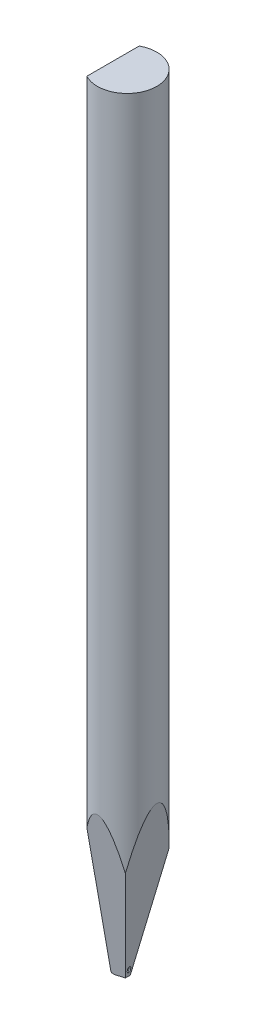
ISO-10303-21;
HEADER;
FILE_DESCRIPTION(('STEP AP214'),'2;1');
FILE_NAME('part.step','',(''),(''),'','','');
FILE_SCHEMA(('AUTOMOTIVE_DESIGN { 1 0 10303 214 1 1 1 1 }'));
ENDSEC;
DATA;
#1=APPLICATION_CONTEXT('core data for automotive mechanical design processes');
#2=APPLICATION_PROTOCOL_DEFINITION('international standard','automotive_design',2000,#1);
#3=PRODUCT_CONTEXT('',#1,'mechanical');
#4=PRODUCT('Part','Part','',(#3));
#5=PRODUCT_RELATED_PRODUCT_CATEGORY('part','',(#4));
#6=PRODUCT_DEFINITION_FORMATION('','',#4);
#7=PRODUCT_DEFINITION_CONTEXT('part definition',#1,'design');
#8=PRODUCT_DEFINITION('design','',#6,#7);
#9=PRODUCT_DEFINITION_SHAPE('','',#8);
#10=(LENGTH_UNIT() NAMED_UNIT(*) SI_UNIT(.MILLI.,.METRE.));
#11=(NAMED_UNIT(*) PLANE_ANGLE_UNIT() SI_UNIT($,.RADIAN.));
#12=(NAMED_UNIT(*) SI_UNIT($,.STERADIAN.) SOLID_ANGLE_UNIT());
#13=UNCERTAINTY_MEASURE_WITH_UNIT(LENGTH_MEASURE(1.E-05),#10,'distance_accuracy_value','');
#14=(GEOMETRIC_REPRESENTATION_CONTEXT(3) GLOBAL_UNCERTAINTY_ASSIGNED_CONTEXT((#13)) GLOBAL_UNIT_ASSIGNED_CONTEXT((#10,
#11,#12)) REPRESENTATION_CONTEXT('',''));
#15=CARTESIAN_POINT('',(0.,0.,0.));
#16=DIRECTION('',(0.,0.,1.));
#17=DIRECTION('',(1.,0.,0.));
#18=AXIS2_PLACEMENT_3D('',#15,#16,#17);
#19=CARTESIAN_POINT('',(26.8738719491216,0.,0.0508));
#20=DIRECTION('',(0.,-0.173648177666931,0.984807753012208));
#21=DIRECTION('',(0.,-0.984807753012208,-0.173648177666931));
#22=AXIS2_PLACEMENT_3D('',#19,#20,#21);
#23=PLANE('',#22);
#24=CARTESIAN_POINT('',(-0.34798,0.02794,0.0557265758409919));
#25=DIRECTION('',(0.,-0.173648177666931,0.984807753012208));
#26=DIRECTION('',(0.,-0.984807753012208,-0.173648177666931));
#27=AXIS2_PLACEMENT_3D('',#24,#25,#26);
#28=ELLIPSE('',#27,0.0283710195360877,0.02794);
#29=CARTESIAN_POINT('',(-0.347980000000001,0.,0.0508));
#30=VERTEX_POINT('',#29);
#31=CARTESIAN_POINT('',(-0.37592,0.02794,0.0557265758409919));
#32=VERTEX_POINT('',#31);
#33=EDGE_CURVE('E175',#30,#32,#28,.F.);
#34=ORIENTED_EDGE('',*,*,#33,.F.);
#35=DIRECTION('',(-1.,0.,0.));
#36=VECTOR('',#35,1.);
#37=CARTESIAN_POINT('',(26.8738719491216,0.,0.0508));
#38=LINE('',#37,#36);
#39=CARTESIAN_POINT('',(-0.279399999999999,0.,0.0508000000000002));
#40=VERTEX_POINT('',#39);
#41=EDGE_CURVE('E226',#40,#30,#38,.T.);
#42=ORIENTED_EDGE('',*,*,#41,.F.);
#43=DIRECTION('',(-0.964921520309631,-0.258549942126377,-0.0455893306574928));
#44=VECTOR('',#43,1.);
#45=CARTESIAN_POINT('',(25.0022930459355,6.77420923494997,1.24527586108614));
#46=LINE('',#45,#44);
#47=CARTESIAN_POINT('',(0.0191872540822884,0.0800062136015736,0.0649072540822819));
#48=VERTEX_POINT('',#47);
#49=EDGE_CURVE('E233',#48,#40,#46,.T.);
#50=ORIENTED_EDGE('',*,*,#49,.F.);
#51=DIRECTION('',(-0.171087869746036,-0.970287525247814,-0.171087869746036));
#52=VECTOR('',#51,1.);
#53=CARTESIAN_POINT('',(0.791557999082995,4.46033837772866,0.837277999082991));
#54=LINE('',#53,#52);
#55=CARTESIAN_POINT('',(0.537041505266776,3.01690361355589,0.582761505266771));
#56=VERTEX_POINT('',#55);
#57=EDGE_CURVE('E237',#56,#48,#54,.T.);
#58=ORIENTED_EDGE('',*,*,#57,.F.);
#59=CARTESIAN_POINT('',(0.,-0.288101116436578,0.));
#60=DIRECTION('',(0.,-0.173648177666931,0.984807753012208));
#61=DIRECTION('',(0.,-0.984807753012208,-0.173648177666931));
#62=AXIS2_PLACEMENT_3D('',#59,#60,#61);
#63=ELLIPSE('',#62,4.56371043248163,0.792479999999998);
#64=CARTESIAN_POINT('',(-0.37592,3.66844093071415,0.69764511322018));
#65=VERTEX_POINT('',#64);
#66=EDGE_CURVE('E235',#56,#65,#63,.T.);
#67=ORIENTED_EDGE('',*,*,#66,.T.);
#68=DIRECTION('',(0.,0.984807753012208,0.173648177666931));
#69=VECTOR('',#68,1.);
#70=CARTESIAN_POINT('',(-0.37592,20.251112252608,3.62161747949059));
#71=LINE('',#70,#69);
#72=EDGE_CURVE('E54',#32,#65,#71,.T.);
#73=ORIENTED_EDGE('',*,*,#72,.F.);
#74=EDGE_LOOP('',(#34,#42,#50,#58,#67,#73));
#75=FACE_BOUND('',#74,.T.);
#76=ADVANCED_FACE('F46',(#75),#23,.T.);
#77=CARTESIAN_POINT('',(26.8738719491216,0.,-0.0508));
#78=DIRECTION('',(0.,-0.173648177666931,-0.984807753012208));
#79=DIRECTION('',(0.,0.984807753012208,-0.173648177666931));
#80=AXIS2_PLACEMENT_3D('',#77,#78,#79);
#81=PLANE('',#80);
#82=CARTESIAN_POINT('',(-0.34798,0.02794,-0.0557265758409954));
#83=DIRECTION('',(0.,-0.173648177666931,-0.984807753012208));
#84=DIRECTION('',(0.,0.984807753012208,-0.173648177666931));
#85=AXIS2_PLACEMENT_3D('',#82,#83,#84);
#86=ELLIPSE('',#85,0.0283710195360877,0.02794);
#87=CARTESIAN_POINT('',(-0.37592,0.02794,-0.0557265758409954));
#88=VERTEX_POINT('',#87);
#89=CARTESIAN_POINT('',(-0.347980000085551,0.,-0.0508));
#90=VERTEX_POINT('',#89);
#91=EDGE_CURVE('E76',#88,#90,#86,.F.);
#92=ORIENTED_EDGE('',*,*,#91,.F.);
#93=DIRECTION('',(0.,-0.984807753012208,0.173648177666931));
#94=VECTOR('',#93,1.);
#95=CARTESIAN_POINT('',(-0.37592,20.5255765703836,-3.67001294395617));
#96=LINE('',#95,#94);
#97=CARTESIAN_POINT('',(-0.37592,3.66844093071414,-0.69764511322018));
#98=VERTEX_POINT('',#97);
#99=EDGE_CURVE('E167',#98,#88,#96,.T.);
#100=ORIENTED_EDGE('',*,*,#99,.F.);
#101=CARTESIAN_POINT('',(0.,-0.288101116436578,0.));
#102=DIRECTION('',(0.,-0.173648177666931,-0.984807753012208));
#103=DIRECTION('',(0.,-0.984807753012208,0.173648177666931));
#104=AXIS2_PLACEMENT_3D('',#101,#102,#103);
#105=ELLIPSE('',#104,4.56371043248163,0.792479999999998);
#106=CARTESIAN_POINT('',(0.537041505266776,3.01690361355589,-0.582761505266771));
#107=VERTEX_POINT('',#106);
#108=EDGE_CURVE('E387',#98,#107,#105,.T.);
#109=ORIENTED_EDGE('',*,*,#108,.T.);
#110=DIRECTION('',(0.171087869746036,0.970287525247814,-0.171087869746036));
#111=VECTOR('',#110,1.);
#112=CARTESIAN_POINT('',(0.791557999082995,4.46033837772866,-0.837277999082991));
#113=LINE('',#112,#111);
#114=CARTESIAN_POINT('',(0.0191872540822884,0.0800062136015736,-0.0649072540822819));
#115=VERTEX_POINT('',#114);
#116=EDGE_CURVE('E250',#115,#107,#113,.T.);
#117=ORIENTED_EDGE('',*,*,#116,.F.);
#118=DIRECTION('',(0.964921520309631,0.258549942126377,-0.0455893306574928));
#119=VECTOR('',#118,1.);
#120=CARTESIAN_POINT('',(25.0022930459355,6.77420923494997,-1.24527586108614));
#121=LINE('',#120,#119);
#122=CARTESIAN_POINT('',(-0.279399999999999,0.,-0.0508000000000001));
#123=VERTEX_POINT('',#122);
#124=EDGE_CURVE('E358',#123,#115,#121,.T.);
#125=ORIENTED_EDGE('',*,*,#124,.F.);
#126=DIRECTION('',(-1.,0.,0.));
#127=VECTOR('',#126,1.);
#128=CARTESIAN_POINT('',(26.8738719491216,0.,-0.0508));
#129=LINE('',#128,#127);
#130=EDGE_CURVE('E232',#123,#90,#129,.T.);
#131=ORIENTED_EDGE('',*,*,#130,.T.);
#132=EDGE_LOOP('',(#92,#100,#109,#117,#125,#131));
#133=FACE_BOUND('',#132,.T.);
#134=ADVANCED_FACE('F270',(#133),#81,.T.);
#135=CARTESIAN_POINT('',(0.,21.0312,0.));
#136=DIRECTION('',(0.,-1.,0.));
#137=DIRECTION('',(0.,0.,-1.));
#138=AXIS2_PLACEMENT_3D('',#135,#136,#137);
#139=CYLINDRICAL_SURFACE('',#138,0.792479999999998);
#140=ORIENTED_EDGE('',*,*,#66,.F.);
#141=CARTESIAN_POINT('',(0.,-0.0288101116436568,0.));
#142=DIRECTION('',(-0.984807753012208,0.173648177666931,0.));
#143=DIRECTION('',(-0.173648177666931,-0.984807753012208,0.));
#144=AXIS2_PLACEMENT_3D('',#141,#142,#143);
#145=ELLIPSE('',#144,4.56371043248164,0.792479999999998);
#146=EDGE_CURVE('E380',#56,#107,#145,.T.);
#147=ORIENTED_EDGE('',*,*,#146,.T.);
#148=ORIENTED_EDGE('',*,*,#108,.F.);
#149=DIRECTION('',(0.,-1.,0.));
#150=VECTOR('',#149,1.);
#151=CARTESIAN_POINT('',(-0.37592,21.0312,-0.69764511322018));
#152=LINE('',#151,#150);
#153=CARTESIAN_POINT('',(-0.37592,21.0312,-0.69764511322018));
#154=VERTEX_POINT('',#153);
#155=EDGE_CURVE('E393',#154,#98,#152,.T.);
#156=ORIENTED_EDGE('',*,*,#155,.F.);
#157=CARTESIAN_POINT('',(0.,21.0312,0.));
#158=DIRECTION('',(0.,1.,0.));
#159=DIRECTION('',(0.,0.,1.));
#160=AXIS2_PLACEMENT_3D('',#157,#158,#159);
#161=CIRCLE('',#160,0.792479999999998);
#162=CARTESIAN_POINT('',(-0.37592,21.0312,0.69764511322018));
#163=VERTEX_POINT('',#162);
#164=EDGE_CURVE('E395',#163,#154,#161,.T.);
#165=ORIENTED_EDGE('',*,*,#164,.F.);
#166=DIRECTION('',(0.,-1.,0.));
#167=VECTOR('',#166,1.);
#168=CARTESIAN_POINT('',(-0.37592,21.0312,0.69764511322018));
#169=LINE('',#168,#167);
#170=EDGE_CURVE('E391',#65,#163,#169,.F.);
#171=ORIENTED_EDGE('',*,*,#170,.F.);
#172=EDGE_LOOP('',(#140,#147,#148,#156,#165,#171));
#173=FACE_BOUND('',#172,.T.);
#174=ADVANCED_FACE('F269',(#173),#139,.T.);
#175=CARTESIAN_POINT('',(-0.37592,21.0312,-0.80247998));
#176=DIRECTION('',(-1.,0.,0.));
#177=DIRECTION('',(0.,0.,1.));
#178=AXIS2_PLACEMENT_3D('',#175,#176,#177);
#179=PLANE('',#178);
#180=DIRECTION('',(0.,0.,-1.));
#181=VECTOR('',#180,1.);
#182=CARTESIAN_POINT('',(-0.37592,0.02794,27.1389929885922));
#183=LINE('',#182,#181);
#184=CARTESIAN_POINT('',(-0.37592,0.02793908033235,0.0139956050864476));
#185=VERTEX_POINT('',#184);
#186=EDGE_CURVE('E68',#32,#185,#183,.T.);
#187=ORIENTED_EDGE('',*,*,#186,.F.);
#188=ORIENTED_EDGE('',*,*,#72,.T.);
#189=ORIENTED_EDGE('',*,*,#170,.T.);
#190=DIRECTION('',(0.,0.,-1.));
#191=VECTOR('',#190,1.);
#192=CARTESIAN_POINT('',(-0.37592,21.0312,-0.80247998));
#193=LINE('',#192,#191);
#194=EDGE_CURVE('E389',#163,#154,#193,.T.);
#195=ORIENTED_EDGE('',*,*,#194,.T.);
#196=ORIENTED_EDGE('',*,*,#155,.T.);
#197=ORIENTED_EDGE('',*,*,#99,.T.);
#198=CARTESIAN_POINT('',(-0.37592,0.02794,-0.0136851285480813));
#199=VERTEX_POINT('',#198);
#200=EDGE_CURVE('E164',#199,#88,#183,.T.);
#201=ORIENTED_EDGE('',*,*,#200,.F.);
#202=CARTESIAN_POINT('',(-0.37592,0.,0.0508000000000002));
#203=CARTESIAN_POINT('',(-0.37592,0.0156730679254453,0.0367453037282476));
#204=CARTESIAN_POINT('',(-0.37592,0.0304799999999994,0.0187327107269303));
#205=CARTESIAN_POINT('',(-0.37592,0.0304799999999994,-0.0187327107269307));
#206=CARTESIAN_POINT('',(-0.37592,0.0156730679254463,-0.0367453037282485));
#207=CARTESIAN_POINT('',(-0.37592,0.,-0.0508000000000001));
#208=(BOUNDED_CURVE() B_SPLINE_CURVE(3,(#202,#203,#204,#205,#206,#207),.UNSPECIFIED.,.F.,
.F.) B_SPLINE_CURVE_WITH_KNOTS((4,2,4),(1.37145902181257,1.5707963267949,1.77013363177722),
.UNSPECIFIED.) CURVE() GEOMETRIC_REPRESENTATION_ITEM() RATIONAL_B_SPLINE_CURVE((1.,1.,1.,1.,1.,1.)) REPRESENTATION_ITEM(''));
#209=EDGE_CURVE('E154',#199,#185,#208,.F.);
#210=ORIENTED_EDGE('',*,*,#209,.T.);
#211=EDGE_LOOP('',(#187,#188,#189,#195,#196,#197,#201,#210));
#212=FACE_BOUND('',#211,.T.);
#213=ADVANCED_FACE('F165',(#212),#179,.T.);
#214=CARTESIAN_POINT('',(0.,21.0312,0.));
#215=DIRECTION('',(0.,1.,0.));
#216=DIRECTION('',(0.,0.,1.));
#217=AXIS2_PLACEMENT_3D('',#214,#215,#216);
#218=PLANE('',#217);
#219=ORIENTED_EDGE('',*,*,#164,.T.);
#220=ORIENTED_EDGE('',*,*,#194,.F.);
#221=EDGE_LOOP('',(#219,#220));
#222=FACE_BOUND('',#221,.T.);
#223=ADVANCED_FACE('F268',(#222),#218,.T.);
#224=CARTESIAN_POINT('',(-0.2794,0.,27.2760283406468));
#225=DIRECTION('',(-0.258819045102522,0.965925826289068,0.));
#226=DIRECTION('',(-0.965925826289068,-0.258819045102522,0.));
#227=AXIS2_PLACEMENT_3D('',#224,#225,#226);
#228=PLANE('',#227);
#229=CARTESIAN_POINT('',(-1.21786149607126,-0.25146,0.));
#230=DIRECTION('',(-0.258819045102522,0.965925826289068,0.));
#231=DIRECTION('',(-0.965925826289068,-0.258819045102522,0.));
#232=AXIS2_PLACEMENT_3D('',#229,#230,#231);
#233=ELLIPSE('',#232,0.991194445904787,0.25654);
#234=CARTESIAN_POINT('',(-0.264733808356437,0.00392979420693135,0.0242657086222775));
#235=VERTEX_POINT('',#234);
#236=EDGE_CURVE('E229',#40,#235,#233,.T.);
#237=ORIENTED_EDGE('',*,*,#236,.T.);
#238=CARTESIAN_POINT('',(-0.254103372255282,0.00677821097542784,0.));
#239=DIRECTION('',(-0.258819045102522,0.965925826289068,0.));
#240=DIRECTION('',(-0.965925826289068,-0.258819045102522,0.));
#241=AXIS2_PLACEMENT_3D('',#238,#239,#240);
#242=ELLIPSE('',#241,0.0372434913152467,0.0254);
#243=CARTESIAN_POINT('',(-0.254103372255282,0.00677821097542785,0.0253999999999992));
#244=VERTEX_POINT('',#243);
#245=EDGE_CURVE('E343',#235,#244,#242,.T.);
#246=ORIENTED_EDGE('',*,*,#245,.T.);
#247=DIRECTION('',(-0.965925826289068,-0.258819045102522,0.));
#248=VECTOR('',#247,1.);
#249=CARTESIAN_POINT('',(-0.2794,0.,0.0253999999999983));
#250=LINE('',#249,#248);
#251=CARTESIAN_POINT('',(-0.14605,0.0357310248106903,0.0253999999999992));
#252=VERTEX_POINT('',#251);
#253=EDGE_CURVE('E338',#252,#244,#250,.T.);
#254=ORIENTED_EDGE('',*,*,#253,.F.);
#255=DIRECTION('',(0.,0.,1.));
#256=VECTOR('',#255,1.);
#257=CARTESIAN_POINT('',(-0.14605,0.0357310248106903,27.2760283406468));
#258=LINE('',#257,#256);
#259=CARTESIAN_POINT('',(-0.14605,0.0357310248106903,-0.0253999999999992));
#260=VERTEX_POINT('',#259);
#261=EDGE_CURVE('E356',#260,#252,#258,.T.);
#262=ORIENTED_EDGE('',*,*,#261,.F.);
#263=DIRECTION('',(-0.965925826289068,-0.258819045102522,0.));
#264=VECTOR('',#263,1.);
#265=CARTESIAN_POINT('',(-0.2794,0.,-0.0253999999999983));
#266=LINE('',#265,#264);
#267=CARTESIAN_POINT('',(-0.254103372255282,0.00677821097542784,-0.0253999999999992));
#268=VERTEX_POINT('',#267);
#269=EDGE_CURVE('E353',#260,#268,#266,.T.);
#270=ORIENTED_EDGE('',*,*,#269,.T.);
#271=CARTESIAN_POINT('',(-0.264733808352492,0.00392979420414491,-0.0242657086524632));
#272=VERTEX_POINT('',#271);
#273=EDGE_CURVE('E350',#268,#272,#242,.T.);
#274=ORIENTED_EDGE('',*,*,#273,.T.);
#275=EDGE_CURVE('E337',#272,#123,#233,.T.);
#276=ORIENTED_EDGE('',*,*,#275,.T.);
#277=ORIENTED_EDGE('',*,*,#124,.T.);
#278=DIRECTION('',(0.,0.,-1.));
#279=VECTOR('',#278,1.);
#280=CARTESIAN_POINT('',(0.0191872540822821,0.0800062136015742,27.2760283406468));
#281=LINE('',#280,#279);
#282=EDGE_CURVE('E376',#48,#115,#281,.T.);
#283=ORIENTED_EDGE('',*,*,#282,.F.);
#284=ORIENTED_EDGE('',*,*,#49,.T.);
#285=EDGE_LOOP('',(#237,#246,#254,#262,#270,#274,#276,#277,#283,#284));
#286=FACE_BOUND('',#285,.T.);
#287=ADVANCED_FACE('F274',(#286),#228,.F.);
#288=CARTESIAN_POINT('',(0.0191872540822821,0.0800062136015742,27.2760283406468));
#289=DIRECTION('',(-0.984807753012208,0.173648177666931,0.));
#290=DIRECTION('',(-0.173648177666931,-0.984807753012208,0.));
#291=AXIS2_PLACEMENT_3D('',#288,#289,#290);
#292=PLANE('',#291);
#293=CARTESIAN_POINT('',(0.0500308683740947,0.254929042586032,0.));
#294=DIRECTION('',(-0.984807753012208,0.173648177666931,0.));
#295=DIRECTION('',(0.173648177666931,0.984807753012208,0.));
#296=AXIS2_PLACEMENT_3D('',#293,#294,#295);
#297=ELLIPSE('',#296,0.0783705194739165,0.0465617325680185);
#298=CARTESIAN_POINT('',(0.063639766263551,0.332108937771539,0.));
#299=VERTEX_POINT('',#298);
#300=EDGE_CURVE('E349',#299,#299,#297,.F.);
#301=ORIENTED_EDGE('',*,*,#300,.F.);
#302=EDGE_LOOP('',(#301));
#303=FACE_BOUND('',#302,.T.);
#304=ORIENTED_EDGE('',*,*,#146,.F.);
#305=ORIENTED_EDGE('',*,*,#57,.T.);
#306=ORIENTED_EDGE('',*,*,#282,.T.);
#307=ORIENTED_EDGE('',*,*,#116,.T.);
#308=EDGE_LOOP('',(#304,#305,#306,#307));
#309=FACE_BOUND('',#308,.T.);
#310=ADVANCED_FACE('F402',(#303,#309),#292,.F.);
#311=CARTESIAN_POINT('',(26.7532219491216,-0.25146,0.));
#312=DIRECTION('',(-1.,0.,0.));
#313=DIRECTION('',(0.,0.,1.));
#314=AXIS2_PLACEMENT_3D('',#311,#312,#313);
#315=CYLINDRICAL_SURFACE('',#314,0.25654);
#316=ORIENTED_EDGE('',*,*,#41,.T.);
#317=CARTESIAN_POINT('',(-0.34798,0.,0.0508000000000002));
#318=CARTESIAN_POINT('',(-0.348317034275368,-1.95498864721182E-07,0.0508008781110156));
#319=CARTESIAN_POINT('',(-0.348652882554057,6.09058352646301E-06,0.0507698555109783));
#320=CARTESIAN_POINT('',(-0.349310370193316,2.98276873566171E-05,0.0506521866941324));
#321=CARTESIAN_POINT('',(-0.349632130291637,4.71463820742279E-05,0.0505661996869117));
#322=CARTESIAN_POINT('',(-0.350343189870529,9.72317087413425E-05,0.0503164958089202));
#323=CARTESIAN_POINT('',(-0.350726995325502,0.000132922205917092,0.0501379809605497));
#324=CARTESIAN_POINT('',(-0.351461784570349,0.000215314730286161,0.0497227626357782));
#325=CARTESIAN_POINT('',(-0.35181258958633,0.000262072393707095,0.0494857648925735));
#326=CARTESIAN_POINT('',(-0.352701835537825,0.000396120696788214,0.0488001302152645));
#327=CARTESIAN_POINT('',(-0.353210971399082,0.00048976973175838,0.0483151705523381));
#328=CARTESIAN_POINT('',(-0.354153066298788,0.000686278626896168,0.0472790786241876));
#329=CARTESIAN_POINT('',(-0.354585852020938,0.000789158663489215,0.046727800463236));
#330=CARTESIAN_POINT('',(-0.356057248157008,0.00116968749615643,0.0446466663416212));
#331=CARTESIAN_POINT('',(-0.356922054527378,0.00145658369106064,0.0429980636277828));
#332=CARTESIAN_POINT('',(-0.358418327061621,0.00201182815926466,0.0395965121582918));
#333=CARTESIAN_POINT('',(-0.359048364971336,0.00228005508022365,0.0378429976895571));
#334=CARTESIAN_POINT('',(-0.361233335779979,0.00327390465566257,0.0308375976095949));
#335=CARTESIAN_POINT('',(-0.362213721181672,0.00387828467394793,0.0253932519244206));
#336=CARTESIAN_POINT('',(-0.363553585406459,0.00473548613736154,0.0144099229426628));
#337=CARTESIAN_POINT('',(-0.363910423195717,0.00498681134385641,0.00887063697145047));
#338=CARTESIAN_POINT('',(-0.364126006902871,0.00513641021699612,-0.0027097361851169));
#339=CARTESIAN_POINT('',(-0.363938489772191,0.00500190451816946,-0.00875236417378941));
#340=CARTESIAN_POINT('',(-0.362908640405255,0.0043103317996175,-0.0207303206890524));
#341=CARTESIAN_POINT('',(-0.362071185662445,0.00375641304018454,-0.0266661129175811));
#342=CARTESIAN_POINT('',(-0.360034337220493,0.0027265251042186,-0.0347485043306079));
#343=CARTESIAN_POINT('',(-0.359351985013454,0.00240250798008866,-0.0370356447045719));
#344=CARTESIAN_POINT('',(-0.358025461720356,0.00186325073853408,-0.0405183718933424));
#345=CARTESIAN_POINT('',(-0.3574926280248,0.00166164001838554,-0.0417578902147241));
#346=CARTESIAN_POINT('',(-0.356279925772437,0.0012533977886992,-0.0441606826728014));
#347=CARTESIAN_POINT('',(-0.35560074866714,0.00104679381369056,-0.0453242829322954));
#348=CARTESIAN_POINT('',(-0.35450617527347,0.000771152502171666,-0.0468230805595258));
#349=CARTESIAN_POINT('',(-0.354186566059723,0.000695885259945767,-0.0472264489962222));
#350=CARTESIAN_POINT('',(-0.353506157442036,0.000549715246427429,-0.0480002996619276));
#351=CARTESIAN_POINT('',(-0.353145253028612,0.000478824340656087,-0.0483706935931604));
#352=CARTESIAN_POINT('',(-0.352370150788241,0.000344216675898394,-0.0490666456641477));
#353=CARTESIAN_POINT('',(-0.351955227477715,0.000280625079729343,-0.0493914383045863));
#354=CARTESIAN_POINT('',(-0.351073908969805,0.000168320982586117,-0.0499604139942811));
#355=CARTESIAN_POINT('',(-0.350607953881492,0.000119493094532457,-0.05020522344127));
#356=CARTESIAN_POINT('',(-0.349781106518732,5.60867116691717E-05,-0.0505217643539964));
#357=CARTESIAN_POINT('',(-0.349432429953809,3.55831158833299E-05,-0.0506236246047409));
#358=CARTESIAN_POINT('',(-0.348716571405613,7.30711906742591E-06,-0.050763836946834));
#359=CARTESIAN_POINT('',(-0.348349184499939,-2.59758334730819E-07,-0.0508011639102839));
#360=CARTESIAN_POINT('',(-0.347980000085552,-2.55136181675685E-11,-0.0508000002181382));
#361=B_SPLINE_CURVE_WITH_KNOTS('',3,(#317,#318,#319,#320,#321,#322,#323,#324,#325,#326,#327,
#328,#329,#330,#331,#332,#333,#334,#335,#336,#337,#338,#339,#340,#341,#342,#343,#344,#345,#346,
#347,#348,#349,#350,#351,#352,#353,#354,#355,#356,#357,#358,#359,#360),.UNSPECIFIED.,.F.,.F.,(4,
2,2,2,2,2,2,2,2,2,2,2,2,2,2,2,2,2,2,2,2,4),(0.,0.00100770207539444,0.00200353952821186,
0.0032707963305662,0.00454456443901501,0.00666056230878129,0.00878130340047385,
0.0143887356236061,0.0200297452516396,0.0366055218467738,0.0532513364472439,0.0713521146601964,
0.0893183527465209,0.0965259669437899,0.100613515175234,0.104682158021851,0.106240557434558,
0.107803011664294,0.109389171167141,0.110962592849042,0.112048194775609,0.113150888532435),.UNSPECIFIED.);
#362=CARTESIAN_POINT('',(-0.36115473874151,0.0033123258148279,0.0300571567389808));
#363=VERTEX_POINT('',#362);
#364=EDGE_CURVE('E180',#30,#363,#361,.T.);
#365=ORIENTED_EDGE('',*,*,#364,.T.);
#366=CARTESIAN_POINT('',(-0.37592,0.,-0.0508000000000001));
#367=CARTESIAN_POINT('',(-0.363217876605219,0.00337516606040596,-0.0340929280009906));
#368=CARTESIAN_POINT('',(-0.35052,0.00508000000000001,-0.0170459542388484));
#369=CARTESIAN_POINT('',(-0.35052,0.00508000000000004,0.017045954238848));
#370=CARTESIAN_POINT('',(-0.363217876605219,0.00337516606040591,0.034092928000991));
#371=CARTESIAN_POINT('',(-0.37592,0.,0.0508000000000002));
#372=(BOUNDED_CURVE() B_SPLINE_CURVE(3,(#366,#367,#368,#369,#370,#371),.UNSPECIFIED.,.F.,
.F.) B_SPLINE_CURVE_WITH_KNOTS((4,2,4),(1.37145902181257,1.5707963267949,1.77013363177722),
.UNSPECIFIED.) CURVE() GEOMETRIC_REPRESENTATION_ITEM() RATIONAL_B_SPLINE_CURVE((1.,1.,1.,1.,1.,1.)) REPRESENTATION_ITEM(''));
#373=CARTESIAN_POINT('',(-0.36115468820211,0.00331232202723724,-0.0300571888910073));
#374=VERTEX_POINT('',#373);
#375=EDGE_CURVE('E160',#363,#374,#372,.F.);
#376=ORIENTED_EDGE('',*,*,#375,.T.);
#377=EDGE_CURVE('E172',#374,#90,#361,.T.);
#378=ORIENTED_EDGE('',*,*,#377,.T.);
#379=ORIENTED_EDGE('',*,*,#130,.F.);
#380=ORIENTED_EDGE('',*,*,#275,.F.);
#381=CARTESIAN_POINT('',(-0.264733808356437,0.00392979420693128,0.0242657086222778));
#382=CARTESIAN_POINT('',(-0.271505513636501,0.00362003466791613,0.0275258411061107));
#383=CARTESIAN_POINT('',(-0.280100471239404,0.00372987756185095,0.0266946346534511));
#384=CARTESIAN_POINT('',(-0.294126758954991,0.00453086740243684,0.0174112875991885));
#385=CARTESIAN_POINT('',(-0.29922124600482,0.00508408546290383,0.00883945425594088));
#386=CARTESIAN_POINT('',(-0.299168629380865,0.00507586045930396,-0.00907502264157514));
#387=CARTESIAN_POINT('',(-0.294080896153495,0.00452378724719881,-0.0175124862723184));
#388=CARTESIAN_POINT('',(-0.28000507615132,0.00372115999770107,-0.0267761478014357));
#389=CARTESIAN_POINT('',(-0.271467376718116,0.00361714328970951,-0.0275562720523674));
#390=CARTESIAN_POINT('',(-0.264733808344899,0.0039297942066392,-0.0242657086253521));
#391=(BOUNDED_CURVE() B_SPLINE_CURVE(3,(#381,#382,#383,#384,#385,#386,#387,#388,#389,#390),
.UNSPECIFIED.,.F.,.F.) B_SPLINE_CURVE_WITH_KNOTS((4,2,2,2,4),(5.05262185410603E-06,
2.20057844752958E-05,3.89589470964855E-05,5.59121097176753E-05,7.2865272338865E-05),
.UNSPECIFIED.) CURVE() GEOMETRIC_REPRESENTATION_ITEM() RATIONAL_B_SPLINE_CURVE((1.,1.,1.,1.,1.,
1.,1.,1.,1.,1.)) REPRESENTATION_ITEM(''));
#392=EDGE_CURVE('E330',#272,#235,#391,.F.);
#393=ORIENTED_EDGE('',*,*,#392,.T.);
#394=ORIENTED_EDGE('',*,*,#236,.F.);
#395=EDGE_LOOP('',(#316,#365,#376,#378,#379,#380,#393,#394));
#396=FACE_BOUND('',#395,.T.);
#397=ADVANCED_FACE('F193',(#396),#315,.F.);
#398=CARTESIAN_POINT('',(-0.14605,0.0711200000000001,0.0254));
#399=DIRECTION('',(-1.,0.,0.));
#400=DIRECTION('',(0.,0.,1.));
#401=AXIS2_PLACEMENT_3D('',#398,#399,#400);
#402=PLANE('',#401);
#403=ORIENTED_EDGE('',*,*,#261,.T.);
#404=DIRECTION('',(0.,1.,0.));
#405=VECTOR('',#404,1.);
#406=CARTESIAN_POINT('',(-0.14605,0.0711200000000001,0.0254));
#407=LINE('',#406,#405);
#408=CARTESIAN_POINT('',(-0.14605,0.0711200000000001,0.0254));
#409=VERTEX_POINT('',#408);
#410=EDGE_CURVE('E451',#252,#409,#407,.T.);
#411=ORIENTED_EDGE('',*,*,#410,.T.);
#412=CARTESIAN_POINT('',(-0.14605,0.0711200000000001,0.));
#413=DIRECTION('',(1.,0.,0.));
#414=DIRECTION('',(0.,1.,0.));
#415=AXIS2_PLACEMENT_3D('',#412,#413,#414);
#416=ELLIPSE('',#415,0.0322330626628433,0.0254);
#417=CARTESIAN_POINT('',(-0.14605,0.0711200000000001,-0.0253999999999983));
#418=VERTEX_POINT('',#417);
#419=EDGE_CURVE('E442',#418,#409,#416,.F.);
#420=ORIENTED_EDGE('',*,*,#419,.F.);
#421=DIRECTION('',(0.,1.,0.));
#422=VECTOR('',#421,1.);
#423=CARTESIAN_POINT('',(-0.14605,0.0711200000000001,-0.0254));
#424=LINE('',#423,#422);
#425=EDGE_CURVE('E452',#260,#418,#424,.T.);
#426=ORIENTED_EDGE('',*,*,#425,.F.);
#427=EDGE_LOOP('',(#403,#411,#420,#426));
#428=FACE_BOUND('',#427,.T.);
#429=ADVANCED_FACE('F422',(#428),#402,.T.);
#430=CARTESIAN_POINT('',(0.,0.,0.0254));
#431=DIRECTION('',(0.,0.,-1.));
#432=DIRECTION('',(-1.,0.,0.));
#433=AXIS2_PLACEMENT_3D('',#430,#431,#432);
#434=PLANE('',#433);
#435=ORIENTED_EDGE('',*,*,#253,.T.);
#436=DIRECTION('',(-0.529919264233209,-0.848048096156424,0.));
#437=VECTOR('',#436,1.);
#438=CARTESIAN_POINT('',(-0.185793587311537,0.116096718492271,0.0254));
#439=LINE('',#438,#437);
#440=CARTESIAN_POINT('',(-0.213898160246811,0.0711200000000001,0.0254));
#441=VERTEX_POINT('',#440);
#442=EDGE_CURVE('E346',#441,#244,#439,.T.);
#443=ORIENTED_EDGE('',*,*,#442,.F.);
#444=DIRECTION('',(-1.,0.,0.));
#445=VECTOR('',#444,1.);
#446=CARTESIAN_POINT('',(-0.243849291692208,0.0711200000000001,0.0254));
#447=LINE('',#446,#445);
#448=EDGE_CURVE('E448',#409,#441,#447,.T.);
#449=ORIENTED_EDGE('',*,*,#448,.F.);
#450=ORIENTED_EDGE('',*,*,#410,.F.);
#451=EDGE_LOOP('',(#435,#443,#449,#450));
#452=FACE_BOUND('',#451,.T.);
#453=ADVANCED_FACE('F434',(#452),#434,.T.);
#454=CARTESIAN_POINT('',(0.,0.,-0.0254));
#455=DIRECTION('',(0.,0.,-1.));
#456=DIRECTION('',(-1.,0.,0.));
#457=AXIS2_PLACEMENT_3D('',#454,#455,#456);
#458=PLANE('',#457);
#459=ORIENTED_EDGE('',*,*,#425,.T.);
#460=DIRECTION('',(-1.,0.,0.));
#461=VECTOR('',#460,1.);
#462=CARTESIAN_POINT('',(-0.243849291692208,0.0711200000000001,-0.0254));
#463=LINE('',#462,#461);
#464=CARTESIAN_POINT('',(-0.213898160246811,0.0711200000000001,-0.0254));
#465=VERTEX_POINT('',#464);
#466=EDGE_CURVE('E447',#418,#465,#463,.T.);
#467=ORIENTED_EDGE('',*,*,#466,.T.);
#468=DIRECTION('',(0.529919264233209,0.848048096156424,0.));
#469=VECTOR('',#468,1.);
#470=CARTESIAN_POINT('',(-0.213898160246811,0.0711200000000001,-0.0254));
#471=LINE('',#470,#469);
#472=EDGE_CURVE('E457',#268,#465,#471,.T.);
#473=ORIENTED_EDGE('',*,*,#472,.F.);
#474=ORIENTED_EDGE('',*,*,#269,.F.);
#475=EDGE_LOOP('',(#459,#467,#473,#474));
#476=FACE_BOUND('',#475,.T.);
#477=ADVANCED_FACE('F427',(#476),#458,.F.);
#478=CARTESIAN_POINT('',(0.013441304957917,0.195728264116419,0.));
#479=DIRECTION('',(0.788010753606725,0.615661475325654,0.));
#480=DIRECTION('',(-0.615661475325654,0.788010753606725,0.));
#481=AXIS2_PLACEMENT_3D('',#478,#479,#480);
#482=CONICAL_SURFACE('',#481,0.0254,0.392699081698725);
#483=CARTESIAN_POINT('',(0.013441304957917,0.195728264116419,0.));
#484=DIRECTION('',(0.788010753606725,0.615661475325654,0.));
#485=DIRECTION('',(-0.615661475325654,0.788010753606725,0.));
#486=AXIS2_PLACEMENT_3D('',#483,#484,#485);
#487=CIRCLE('',#486,0.0254);
#488=CARTESIAN_POINT('',(-0.00219649651535458,0.21574373725803,0.));
#489=VERTEX_POINT('',#488);
#490=EDGE_CURVE('E177',#489,#489,#487,.T.);
#491=ORIENTED_EDGE('',*,*,#490,.F.);
#492=EDGE_LOOP('',(#491));
#493=FACE_BOUND('',#492,.T.);
#494=ORIENTED_EDGE('',*,*,#300,.T.);
#495=EDGE_LOOP('',(#494));
#496=FACE_BOUND('',#495,.T.);
#497=ADVANCED_FACE('F201',(#493,#496),#482,.F.);
#498=CARTESIAN_POINT('',(-0.213898160246811,0.0711200000000001,0.));
#499=DIRECTION('',(-0.529919264233209,-0.848048096156424,0.));
#500=DIRECTION('',(0.848048096156424,-0.529919264233209,0.));
#501=AXIS2_PLACEMENT_3D('',#498,#499,#500);
#502=CYLINDRICAL_SURFACE('',#501,0.0254);
#503=ORIENTED_EDGE('',*,*,#245,.F.);
#504=CARTESIAN_POINT('',(-0.264733808344899,0.0039297942066392,-0.0242657086253521));
#505=CARTESIAN_POINT('',(-0.269825042511271,0.00889421369908929,-0.0221164952907575));
#506=CARTESIAN_POINT('',(-0.27265716009115,0.0117573990215899,-0.0182625417989781));
#507=CARTESIAN_POINT('',(-0.276728090768154,0.0158474714546044,-0.00976906065229427));
#508=CARTESIAN_POINT('',(-0.277638550745827,0.0170220462394604,-0.00498929260732262));
#509=CARTESIAN_POINT('',(-0.277670621218718,0.0170180831019417,0.00485984661323646));
#510=CARTESIAN_POINT('',(-0.276755873907169,0.015843778416175,0.0097111151810321));
#511=CARTESIAN_POINT('',(-0.272726160858244,0.0117501679970495,0.0182048453339337));
#512=CARTESIAN_POINT('',(-0.269865151534738,0.00887150626941777,0.0221096962011505));
#513=CARTESIAN_POINT('',(-0.264733808356437,0.00392979420693128,0.0242657086222778));
#514=(BOUNDED_CURVE() B_SPLINE_CURVE(3,(#504,#505,#506,#507,#508,#509,#510,#511,#512,#513),
.UNSPECIFIED.,.F.,.F.) B_SPLINE_CURVE_WITH_KNOTS((4,2,2,2,4),(5.05262185410603E-06,
2.20057844752958E-05,3.89589470964855E-05,5.59121097176753E-05,7.2865272338865E-05),
.UNSPECIFIED.) CURVE() GEOMETRIC_REPRESENTATION_ITEM() RATIONAL_B_SPLINE_CURVE((1.,1.,1.,1.,1.,
1.,1.,1.,1.,1.)) REPRESENTATION_ITEM(''));
#515=EDGE_CURVE('E329',#235,#272,#514,.F.);
#516=ORIENTED_EDGE('',*,*,#515,.T.);
#517=ORIENTED_EDGE('',*,*,#273,.F.);
#518=ORIENTED_EDGE('',*,*,#472,.T.);
#519=CARTESIAN_POINT('',(-0.213898160246811,0.0711200000000001,0.));
#520=DIRECTION('',(0.,-1.,0.));
#521=DIRECTION('',(-1.,0.,0.));
#522=AXIS2_PLACEMENT_3D('',#519,#520,#521);
#523=ELLIPSE('',#522,0.0299511314453973,0.0254);
#524=EDGE_CURVE('E369',#465,#441,#523,.F.);
#525=ORIENTED_EDGE('',*,*,#524,.T.);
#526=ORIENTED_EDGE('',*,*,#442,.T.);
#527=EDGE_LOOP('',(#503,#516,#517,#518,#525,#526));
#528=FACE_BOUND('',#527,.T.);
#529=ADVANCED_FACE('F344',(#528),#502,.F.);
#530=CARTESIAN_POINT('',(-0.243849291692208,0.0711200000000001,0.0254));
#531=DIRECTION('',(0.,-1.,0.));
#532=DIRECTION('',(0.,0.,-1.));
#533=AXIS2_PLACEMENT_3D('',#530,#531,#532);
#534=PLANE('',#533);
#535=ORIENTED_EDGE('',*,*,#466,.F.);
#536=CARTESIAN_POINT('',(-0.14605,0.0711200000000001,0.));
#537=DIRECTION('',(0.,1.,0.));
#538=DIRECTION('',(1.,0.,0.));
#539=AXIS2_PLACEMENT_3D('',#536,#537,#538);
#540=ELLIPSE('',#539,0.0412564388352619,0.0254);
#541=EDGE_CURVE('E440',#409,#418,#540,.F.);
#542=ORIENTED_EDGE('',*,*,#541,.F.);
#543=ORIENTED_EDGE('',*,*,#448,.T.);
#544=ORIENTED_EDGE('',*,*,#524,.F.);
#545=EDGE_LOOP('',(#535,#542,#543,#544));
#546=FACE_BOUND('',#545,.T.);
#547=ADVANCED_FACE('F433',(#546),#534,.T.);
#548=CARTESIAN_POINT('',(-0.311362417164206,-0.0580362154134752,0.));
#549=DIRECTION('',(0.788010753606725,0.615661475325654,0.));
#550=DIRECTION('',(-0.615661475325654,0.788010753606725,0.));
#551=AXIS2_PLACEMENT_3D('',#548,#549,#550);
#552=CYLINDRICAL_SURFACE('',#551,0.0254);
#553=ORIENTED_EDGE('',*,*,#419,.T.);
#554=ORIENTED_EDGE('',*,*,#541,.T.);
#555=EDGE_LOOP('',(#553,#554));
#556=FACE_BOUND('',#555,.T.);
#557=ORIENTED_EDGE('',*,*,#490,.T.);
#558=EDGE_LOOP('',(#557));
#559=FACE_BOUND('',#558,.T.);
#560=ADVANCED_FACE('F286',(#556,#559),#552,.F.);
#561=CARTESIAN_POINT('',(-0.264733808344899,0.0039297942066392,-0.0242657086253521));
#562=CARTESIAN_POINT('',(-0.271467376718116,0.00361714328970951,-0.0275562720523674));
#563=CARTESIAN_POINT('',(-0.28000507615132,0.00372115999770107,-0.0267761478014357));
#564=CARTESIAN_POINT('',(-0.294080896153495,0.00452378724719881,-0.0175124862723184));
#565=CARTESIAN_POINT('',(-0.299168629380865,0.00507586045930396,-0.00907502264157514));
#566=CARTESIAN_POINT('',(-0.29922124600482,0.00508408546290383,0.00883945425594088));
#567=CARTESIAN_POINT('',(-0.294126758954991,0.00453086740243684,0.0174112875991885));
#568=CARTESIAN_POINT('',(-0.280100471239404,0.00372987756185095,0.0266946346534511));
#569=CARTESIAN_POINT('',(-0.271505513636501,0.00362003466791613,0.0275258411061107));
#570=CARTESIAN_POINT('',(-0.264733808356437,0.00392979420693128,0.0242657086222778));
#571=CARTESIAN_POINT('',(-0.264733808344899,0.0039297942066392,-0.0242657086253521));
#572=CARTESIAN_POINT('',(-0.269760299514186,0.00405811759931211,-0.0229274924479744));
#573=CARTESIAN_POINT('',(-0.27482748235902,0.00438052738708672,-0.0204436846090933));
#574=CARTESIAN_POINT('',(-0.282567284697953,0.00489496440357906,-0.0119802356256567));
#575=CARTESIAN_POINT('',(-0.285095214986219,0.00507857433718163,-0.0061286450476863));
#576=CARTESIAN_POINT('',(-0.2851358396379,0.00508140663831666,0.00596924837322803));
#577=CARTESIAN_POINT('',(-0.282603294694765,0.00489755541703812,0.0119102940271637));
#578=CARTESIAN_POINT('',(-0.274908726123228,0.00438487815071299,0.0203837374568594));
#579=CARTESIAN_POINT('',(-0.269772865731677,0.00405839905890785,0.0229243125213184));
#580=CARTESIAN_POINT('',(-0.264733808356437,0.00392979420693128,0.0242657086222778));
#581=CARTESIAN_POINT('',(-0.264733808344899,0.0039297942066392,-0.0242657086253521));
#582=CARTESIAN_POINT('',(-0.269825042511271,0.00889421369908929,-0.0221164952907575));
#583=CARTESIAN_POINT('',(-0.27265716009115,0.0117573990215899,-0.0182625417989781));
#584=CARTESIAN_POINT('',(-0.276728090768154,0.0158474714546044,-0.00976906065229427));
#585=CARTESIAN_POINT('',(-0.277638550745827,0.0170220462394604,-0.00498929260732262));
#586=CARTESIAN_POINT('',(-0.277670621218718,0.0170180831019417,0.00485984661323646));
#587=CARTESIAN_POINT('',(-0.276755873907169,0.015843778416175,0.0097111151810321));
#588=CARTESIAN_POINT('',(-0.272726160858244,0.0117501679970495,0.0182048453339337));
#589=CARTESIAN_POINT('',(-0.269865151534738,0.00887150626941777,0.0221096962011505));
#590=CARTESIAN_POINT('',(-0.264733808356437,0.00392979420693128,0.0242657086222778));
#591=(BOUNDED_SURFACE() B_SPLINE_SURFACE(2,3,((#561,#562,#563,#564,#565,#566,#567,#568,#569,
#570),(#571,#572,#573,#574,#575,#576,#577,#578,#579,#580),(#581,#582,#583,#584,#585,#586,#587,
#588,#589,#590)),.UNSPECIFIED.,.F.,.F.,.F.) B_SPLINE_SURFACE_WITH_KNOTS((3,3),(4,2,2,2,4),(0.,
1.),(5.05262185410603E-06,2.20057844752958E-05,3.89589470964855E-05,5.59121097176753E-05,
7.2865272338865E-05),
.UNSPECIFIED.) GEOMETRIC_REPRESENTATION_ITEM() RATIONAL_B_SPLINE_SURFACE(((1.,1.,1.,1.,1.,1.,1.,
1.,1.,1.),(0.789383687132973,0.835451084505499,0.852460024015338,0.872602725361386,
0.874593550601268,0.874645517050407,0.872642510118951,0.852660373124676,0.835590297213422,
0.789383687191155),(1.,1.,1.,1.,1.,1.,1.,1.,1.,1.))) REPRESENTATION_ITEM('') SURFACE());
#592=ORIENTED_EDGE('',*,*,#392,.F.);
#593=ORIENTED_EDGE('',*,*,#515,.F.);
#594=EDGE_LOOP('',(#592,#593));
#595=FACE_BOUND('',#594,.T.);
#596=ADVANCED_FACE('F279',(#595),#591,.T.);
#597=CARTESIAN_POINT('',(-0.37592,0.,0.0508000000000002));
#598=CARTESIAN_POINT('',(-0.363217876605219,0.00337516606040591,0.034092928000991));
#599=CARTESIAN_POINT('',(-0.35052,0.00508000000000004,0.017045954238848));
#600=CARTESIAN_POINT('',(-0.35052,0.00508000000000001,-0.0170459542388484));
#601=CARTESIAN_POINT('',(-0.363217876605219,0.00337516606040596,-0.0340929280009906));
#602=CARTESIAN_POINT('',(-0.37592,0.,-0.0508000000000001));
#603=CARTESIAN_POINT('',(-0.37592,0.,0.0508000000000002));
#604=CARTESIAN_POINT('',(-0.375919999999957,0.00337547916256317,0.0340913768704159));
#605=CARTESIAN_POINT('',(-0.375919999999999,0.00508000000000042,0.0170459542388484));
#606=CARTESIAN_POINT('',(-0.375919999999999,0.00507999999999996,-0.0170459542388488));
#607=CARTESIAN_POINT('',(-0.375919999999957,0.00337547916256315,-0.0340913768704157));
#608=CARTESIAN_POINT('',(-0.37592,0.,-0.0508000000000001));
#609=CARTESIAN_POINT('',(-0.37592,0.,0.0508000000000002));
#610=CARTESIAN_POINT('',(-0.37592,0.0156730679254453,0.0367453037282476));
#611=CARTESIAN_POINT('',(-0.37592,0.0304799999999994,0.0187327107269303));
#612=CARTESIAN_POINT('',(-0.37592,0.0304799999999994,-0.0187327107269307));
#613=CARTESIAN_POINT('',(-0.37592,0.0156730679254463,-0.0367453037282485));
#614=CARTESIAN_POINT('',(-0.37592,0.,-0.0508000000000001));
#615=(BOUNDED_SURFACE() B_SPLINE_SURFACE(2,3,((#597,#598,#599,#600,#601,#602),(#603,#604,#605,
#606,#607,#608),(#609,#610,#611,#612,#613,#614)),.UNSPECIFIED.,.F.,.F.,
.F.) B_SPLINE_SURFACE_WITH_KNOTS((3,3),(4,2,4),(0.,1.),(1.37145902181257,1.5707963267949,
1.77013363177722),.UNSPECIFIED.) GEOMETRIC_REPRESENTATION_ITEM() RATIONAL_B_SPLINE_SURFACE(((1.,
1.,1.,1.,1.,1.),(0.707106781186548,0.707106781186548,0.707106781186559,0.707106781186559,
0.707106781186548,0.707106781186548),(1.,1.,1.,1.,1.,1.))) REPRESENTATION_ITEM('') SURFACE());
#616=CARTESIAN_POINT('',(-0.361167226728406,0.00330789389407399,-0.0300925129245823));
#617=CARTESIAN_POINT('',(-0.36144357496511,0.00345516324922478,-0.0287497236702855));
#618=CARTESIAN_POINT('',(-0.361944215876491,0.00372800571313123,-0.0275097429318438));
#619=CARTESIAN_POINT('',(-0.363217451152725,0.00450918990393608,-0.0252476400060377));
#620=CARTESIAN_POINT('',(-0.363991598082938,0.00501888143174254,-0.0242268161989028));
#621=CARTESIAN_POINT('',(-0.36614382244637,0.00664612012678125,-0.0218649888876922));
#622=CARTESIAN_POINT('',(-0.367594867973614,0.00794429653636661,-0.0207280847501565));
#623=CARTESIAN_POINT('',(-0.370756210526317,0.0115183992426213,-0.0184480975813485));
#624=CARTESIAN_POINT('',(-0.372360085606142,0.01397842331997,-0.0174621538234904));
#625=CARTESIAN_POINT('',(-0.374813123977528,0.0195449427040793,-0.0157024700277834));
#626=CARTESIAN_POINT('',(-0.375602840535918,0.0226842489644284,-0.0149479718039412));
#627=CARTESIAN_POINT('',(-0.375894711300334,0.0265523505359759,-0.0141058667856216));
#628=CARTESIAN_POINT('',(-0.375920806884538,0.0272464877703445,-0.0139581275255722));
#629=CARTESIAN_POINT('',(-0.37592,0.02794,-0.0138124417708618));
#630=B_SPLINE_CURVE_WITH_KNOTS('',3,(#616,#617,#618,#619,#620,#621,#622,#623,#624,#625,#626,
#627,#628,#629),.UNSPECIFIED.,.F.,.F.,(4,2,2,2,2,2,4),(0.,0.00405177022600303,
0.00812692010573458,0.0147721442936062,0.0239060220732007,0.0336676617767202,
0.0357960252990981),.UNSPECIFIED.);
#631=EDGE_CURVE('E12',#374,#199,#630,.T.);
#632=CARTESIAN_POINT('',(-0.361167226728407,0.00330789389407404,0.0300925129245831));
#633=CARTESIAN_POINT('',(-0.361443574969088,0.00345516324431132,0.0287497236703693));
#634=CARTESIAN_POINT('',(-0.361944215878315,0.00372800571116553,0.0275097429318984));
#635=CARTESIAN_POINT('',(-0.363217451147776,0.00450918991102884,0.0252476400059559));
#636=CARTESIAN_POINT('',(-0.363991598073343,0.00501888144495275,0.0242268161987022));
#637=CARTESIAN_POINT('',(-0.36614382244267,0.00664612014959833,0.0218649888781543));
#638=CARTESIAN_POINT('',(-0.36759486798817,0.00794429655823362,0.0207280847353407));
#639=CARTESIAN_POINT('',(-0.370756210557304,0.0115183992703542,0.0184480975648709));
#640=CARTESIAN_POINT('',(-0.372360085631232,0.0139784233575211,0.0174621538085601));
#641=CARTESIAN_POINT('',(-0.37481312398465,0.0195449427409257,0.015702470019331));
#642=CARTESIAN_POINT('',(-0.375602840535567,0.0226842489877283,0.0149479717988638));
#643=CARTESIAN_POINT('',(-0.375894711299434,0.0265523505427642,0.0141058667841697));
#644=CARTESIAN_POINT('',(-0.375920806883884,0.0272464877736888,0.0139581275248505));
#645=CARTESIAN_POINT('',(-0.375919999999999,0.02794,0.0138124417708597));
#646=B_SPLINE_CURVE_WITH_KNOTS('',3,(#632,#633,#634,#635,#636,#637,#638,#639,#640,#641,#642,
#643,#644,#645),.UNSPECIFIED.,.F.,.F.,(4,2,2,2,2,2,4),(0.,0.00405177022601686,
0.00812692010556383,0.0147721443337077,0.0239060221203928,0.0336676617847084,
0.0357960252966329),.UNSPECIFIED.);
#647=EDGE_CURVE('E60',#185,#363,#646,.F.);
#648=ORIENTED_EDGE('',*,*,#631,.F.);
#649=ORIENTED_EDGE('',*,*,#375,.F.);
#650=ORIENTED_EDGE('',*,*,#647,.F.);
#651=ORIENTED_EDGE('',*,*,#209,.F.);
#652=EDGE_LOOP('',(#648,#649,#650,#651));
#653=FACE_BOUND('',#652,.T.);
#654=ADVANCED_FACE('F49',(#653),#615,.T.);
#655=CARTESIAN_POINT('',(-0.34798,0.02794,27.1389929885922));
#656=DIRECTION('',(0.,0.,-1.));
#657=DIRECTION('',(-1.,0.,0.));
#658=AXIS2_PLACEMENT_3D('',#655,#656,#657);
#659=CYLINDRICAL_SURFACE('',#658,0.02794);
#660=ORIENTED_EDGE('',*,*,#364,.F.);
#661=ORIENTED_EDGE('',*,*,#33,.T.);
#662=ORIENTED_EDGE('',*,*,#186,.T.);
#663=ORIENTED_EDGE('',*,*,#647,.T.);
#664=EDGE_LOOP('',(#660,#661,#662,#663));
#665=FACE_BOUND('',#664,.T.);
#666=ADVANCED_FACE('F200',(#665),#659,.T.);
#667=ORIENTED_EDGE('',*,*,#200,.T.);
#668=ORIENTED_EDGE('',*,*,#91,.T.);
#669=ORIENTED_EDGE('',*,*,#377,.F.);
#670=ORIENTED_EDGE('',*,*,#631,.T.);
#671=EDGE_LOOP('',(#667,#668,#669,#670));
#672=FACE_BOUND('',#671,.T.);
#673=ADVANCED_FACE('F171',(#672),#659,.T.);
#674=CLOSED_SHELL('',(#76,#134,#174,#213,#223,#287,#310,#397,#429,#453,#477,#497,#529,#547,#560,
#596,#654,#666,#673));
#675=MANIFOLD_SOLID_BREP('B2',#674);
#676=ADVANCED_BREP_SHAPE_REPRESENTATION('',(#18,#675),#14);
#677=SHAPE_DEFINITION_REPRESENTATION(#9,#676);
ENDSEC;
END-ISO-10303-21;
